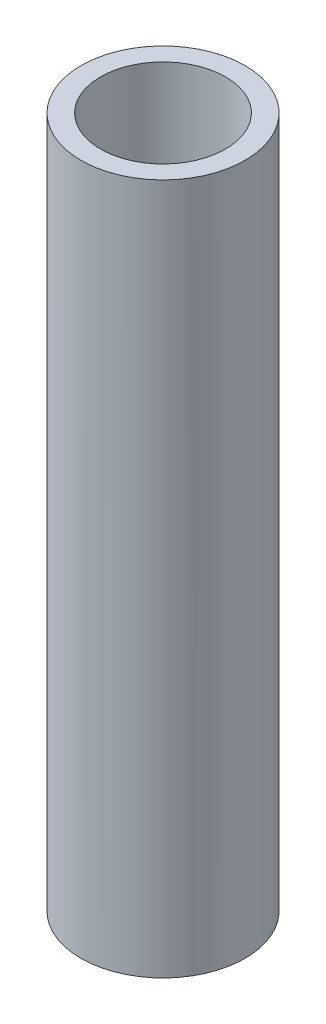
ISO-10303-21;
HEADER;
FILE_DESCRIPTION(('STEP AP214'),'2;1');
FILE_NAME('part.step','',(''),(''),'','','');
FILE_SCHEMA(('AUTOMOTIVE_DESIGN { 1 0 10303 214 1 1 1 1 }'));
ENDSEC;
DATA;
#1=APPLICATION_CONTEXT('core data for automotive mechanical design processes');
#2=APPLICATION_PROTOCOL_DEFINITION('international standard','automotive_design',2000,#1);
#3=PRODUCT_CONTEXT('',#1,'mechanical');
#4=PRODUCT('Part','Part','',(#3));
#5=PRODUCT_RELATED_PRODUCT_CATEGORY('part','',(#4));
#6=PRODUCT_DEFINITION_FORMATION('','',#4);
#7=PRODUCT_DEFINITION_CONTEXT('part definition',#1,'design');
#8=PRODUCT_DEFINITION('design','',#6,#7);
#9=PRODUCT_DEFINITION_SHAPE('','',#8);
#10=(LENGTH_UNIT() NAMED_UNIT(*) SI_UNIT(.MILLI.,.METRE.));
#11=(NAMED_UNIT(*) PLANE_ANGLE_UNIT() SI_UNIT($,.RADIAN.));
#12=(NAMED_UNIT(*) SI_UNIT($,.STERADIAN.) SOLID_ANGLE_UNIT());
#13=UNCERTAINTY_MEASURE_WITH_UNIT(LENGTH_MEASURE(1.E-05),#10,'distance_accuracy_value','');
#14=(GEOMETRIC_REPRESENTATION_CONTEXT(3) GLOBAL_UNCERTAINTY_ASSIGNED_CONTEXT((#13)) GLOBAL_UNIT_ASSIGNED_CONTEXT((#10,
#11,#12)) REPRESENTATION_CONTEXT('',''));
#15=CARTESIAN_POINT('',(0.,0.,0.));
#16=DIRECTION('',(0.,0.,1.));
#17=DIRECTION('',(1.,0.,0.));
#18=AXIS2_PLACEMENT_3D('',#15,#16,#17);
#19=CARTESIAN_POINT('',(0.,0.,0.));
#20=DIRECTION('',(0.,1.,0.));
#21=DIRECTION('',(0.,0.,1.));
#22=AXIS2_PLACEMENT_3D('',#19,#20,#21);
#23=PLANE('',#22);
#24=CARTESIAN_POINT('',(0.,0.,0.));
#25=DIRECTION('',(0.,1.,0.));
#26=DIRECTION('',(0.,0.,1.));
#27=AXIS2_PLACEMENT_3D('',#24,#25,#26);
#28=CIRCLE('',#27,1.05);
#29=CARTESIAN_POINT('',(0.,0.,1.05));
#30=VERTEX_POINT('',#29);
#31=EDGE_CURVE('E44',#30,#30,#28,.T.);
#32=ORIENTED_EDGE('',*,*,#31,.F.);
#33=EDGE_LOOP('',(#32));
#34=FACE_BOUND('',#33,.T.);
#35=CARTESIAN_POINT('',(0.,0.,0.));
#36=DIRECTION('',(0.,1.,0.));
#37=DIRECTION('',(0.,0.,1.));
#38=AXIS2_PLACEMENT_3D('',#35,#36,#37);
#39=CIRCLE('',#38,0.8);
#40=CARTESIAN_POINT('',(0.,0.,0.8));
#41=VERTEX_POINT('',#40);
#42=EDGE_CURVE('E53',#41,#41,#39,.T.);
#43=ORIENTED_EDGE('',*,*,#42,.T.);
#44=EDGE_LOOP('',(#43));
#45=FACE_BOUND('',#44,.T.);
#46=ADVANCED_FACE('F37',(#34,#45),#23,.F.);
#47=CARTESIAN_POINT('',(0.,15.810885557106,0.));
#48=DIRECTION('',(0.,-1.,0.));
#49=DIRECTION('',(0.,0.,-1.));
#50=AXIS2_PLACEMENT_3D('',#47,#48,#49);
#51=CYLINDRICAL_SURFACE('',#50,1.05);
#52=CARTESIAN_POINT('',(0.,8.8410370761225,0.));
#53=DIRECTION('',(0.,-1.,0.));
#54=DIRECTION('',(0.,0.,-1.));
#55=AXIS2_PLACEMENT_3D('',#52,#53,#54);
#56=CIRCLE('',#55,1.05);
#57=CARTESIAN_POINT('',(0.,8.8410370761225,-1.05));
#58=VERTEX_POINT('',#57);
#59=EDGE_CURVE('E48',#58,#58,#56,.T.);
#60=ORIENTED_EDGE('',*,*,#59,.T.);
#61=EDGE_LOOP('',(#60));
#62=FACE_BOUND('',#61,.T.);
#63=ORIENTED_EDGE('',*,*,#31,.T.);
#64=EDGE_LOOP('',(#63));
#65=FACE_BOUND('',#64,.T.);
#66=ADVANCED_FACE('F61',(#62,#65),#51,.T.);
#67=CARTESIAN_POINT('',(0.,15.810885557106,0.));
#68=DIRECTION('',(0.,-1.,0.));
#69=DIRECTION('',(0.,0.,-1.));
#70=AXIS2_PLACEMENT_3D('',#67,#68,#69);
#71=CYLINDRICAL_SURFACE('',#70,0.8);
#72=CARTESIAN_POINT('',(0.,8.8410370761225,0.));
#73=DIRECTION('',(0.,-1.,0.));
#74=DIRECTION('',(0.,0.,-1.));
#75=AXIS2_PLACEMENT_3D('',#72,#73,#74);
#76=CIRCLE('',#75,0.8);
#77=CARTESIAN_POINT('',(0.,8.8410370761225,-0.8));
#78=VERTEX_POINT('',#77);
#79=EDGE_CURVE('E11',#78,#78,#76,.T.);
#80=ORIENTED_EDGE('',*,*,#79,.F.);
#81=EDGE_LOOP('',(#80));
#82=FACE_BOUND('',#81,.T.);
#83=ORIENTED_EDGE('',*,*,#42,.F.);
#84=EDGE_LOOP('',(#83));
#85=FACE_BOUND('',#84,.T.);
#86=ADVANCED_FACE('F59',(#82,#85),#71,.F.);
#87=CARTESIAN_POINT('',(-1.17015654675444,8.8410370761225,5.47637961212403));
#88=DIRECTION('',(0.,-1.,0.));
#89=DIRECTION('',(-0.208956526206151,0.,0.977924930736434));
#90=AXIS2_PLACEMENT_3D('',#87,#88,#89);
#91=PLANE('',#90);
#92=ORIENTED_EDGE('',*,*,#79,.T.);
#93=EDGE_LOOP('',(#92));
#94=FACE_BOUND('',#93,.T.);
#95=ORIENTED_EDGE('',*,*,#59,.F.);
#96=EDGE_LOOP('',(#95));
#97=FACE_BOUND('',#96,.T.);
#98=ADVANCED_FACE('F39',(#94,#97),#91,.F.);
#99=CLOSED_SHELL('',(#46,#66,#86,#98));
#100=MANIFOLD_SOLID_BREP('B2',#99);
#101=ADVANCED_BREP_SHAPE_REPRESENTATION('',(#18,#100),#14);
#102=SHAPE_DEFINITION_REPRESENTATION(#9,#101);
ENDSEC;
END-ISO-10303-21;
